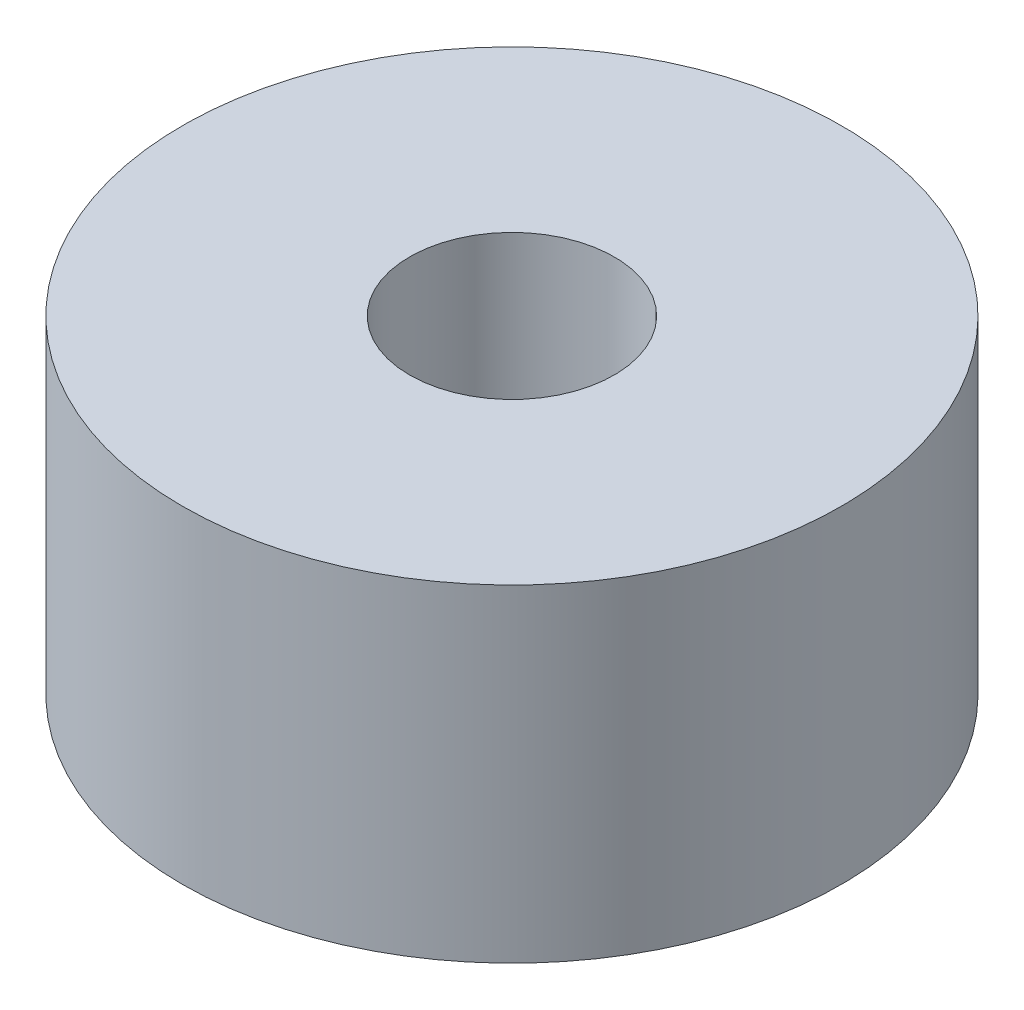
ISO-10303-21;
HEADER;
FILE_DESCRIPTION(('STEP AP214'),'2;1');
FILE_NAME('part.step','',(''),(''),'','','');
FILE_SCHEMA(('AUTOMOTIVE_DESIGN { 1 0 10303 214 1 1 1 1 }'));
ENDSEC;
DATA;
#1=APPLICATION_CONTEXT('core data for automotive mechanical design processes');
#2=APPLICATION_PROTOCOL_DEFINITION('international standard','automotive_design',2000,#1);
#3=PRODUCT_CONTEXT('',#1,'mechanical');
#4=PRODUCT('Part','Part','',(#3));
#5=PRODUCT_RELATED_PRODUCT_CATEGORY('part','',(#4));
#6=PRODUCT_DEFINITION_FORMATION('','',#4);
#7=PRODUCT_DEFINITION_CONTEXT('part definition',#1,'design');
#8=PRODUCT_DEFINITION('design','',#6,#7);
#9=PRODUCT_DEFINITION_SHAPE('','',#8);
#10=(LENGTH_UNIT() NAMED_UNIT(*) SI_UNIT(.MILLI.,.METRE.));
#11=(NAMED_UNIT(*) PLANE_ANGLE_UNIT() SI_UNIT($,.RADIAN.));
#12=(NAMED_UNIT(*) SI_UNIT($,.STERADIAN.) SOLID_ANGLE_UNIT());
#13=UNCERTAINTY_MEASURE_WITH_UNIT(LENGTH_MEASURE(1.E-05),#10,'distance_accuracy_value','');
#14=(GEOMETRIC_REPRESENTATION_CONTEXT(3) GLOBAL_UNCERTAINTY_ASSIGNED_CONTEXT((#13)) GLOBAL_UNIT_ASSIGNED_CONTEXT((#10,
#11,#12)) REPRESENTATION_CONTEXT('',''));
#15=CARTESIAN_POINT('',(0.,0.,0.));
#16=DIRECTION('',(0.,0.,1.));
#17=DIRECTION('',(1.,0.,0.));
#18=AXIS2_PLACEMENT_3D('',#15,#16,#17);
#19=CARTESIAN_POINT('',(0.,16.,0.));
#20=DIRECTION('',(0.,-1.,0.));
#21=DIRECTION('',(0.,0.,-1.));
#22=AXIS2_PLACEMENT_3D('',#19,#20,#21);
#23=CYLINDRICAL_SURFACE('',#22,16.1);
#24=CARTESIAN_POINT('',(0.,16.,0.));
#25=DIRECTION('',(0.,1.,0.));
#26=DIRECTION('',(0.,0.,1.));
#27=AXIS2_PLACEMENT_3D('',#24,#25,#26);
#28=CIRCLE('',#27,16.1);
#29=CARTESIAN_POINT('',(0.,16.,16.1));
#30=VERTEX_POINT('',#29);
#31=EDGE_CURVE('E10',#30,#30,#28,.T.);
#32=ORIENTED_EDGE('',*,*,#31,.F.);
#33=EDGE_LOOP('',(#32));
#34=FACE_BOUND('',#33,.T.);
#35=CARTESIAN_POINT('',(0.,0.,0.));
#36=DIRECTION('',(0.,1.,0.));
#37=DIRECTION('',(0.,0.,1.));
#38=AXIS2_PLACEMENT_3D('',#35,#36,#37);
#39=CIRCLE('',#38,16.1);
#40=CARTESIAN_POINT('',(0.,0.,16.1));
#41=VERTEX_POINT('',#40);
#42=EDGE_CURVE('E33',#41,#41,#39,.T.);
#43=ORIENTED_EDGE('',*,*,#42,.T.);
#44=EDGE_LOOP('',(#43));
#45=FACE_BOUND('',#44,.T.);
#46=ADVANCED_FACE('F30',(#34,#45),#23,.T.);
#47=CARTESIAN_POINT('',(0.,16.,0.));
#48=DIRECTION('',(0.,1.,0.));
#49=DIRECTION('',(0.,0.,1.));
#50=AXIS2_PLACEMENT_3D('',#47,#48,#49);
#51=PLANE('',#50);
#52=CARTESIAN_POINT('',(0.,16.,0.));
#53=DIRECTION('',(0.,1.,0.));
#54=DIRECTION('',(0.,0.,1.));
#55=AXIS2_PLACEMENT_3D('',#52,#53,#54);
#56=CIRCLE('',#55,5.);
#57=CARTESIAN_POINT('',(0.,16.,5.));
#58=VERTEX_POINT('',#57);
#59=EDGE_CURVE('E42',#58,#58,#56,.T.);
#60=ORIENTED_EDGE('',*,*,#59,.F.);
#61=EDGE_LOOP('',(#60));
#62=FACE_BOUND('',#61,.T.);
#63=ORIENTED_EDGE('',*,*,#31,.T.);
#64=EDGE_LOOP('',(#63));
#65=FACE_BOUND('',#64,.T.);
#66=ADVANCED_FACE('F57',(#62,#65),#51,.T.);
#67=CARTESIAN_POINT('',(0.,0.,0.));
#68=DIRECTION('',(0.,1.,0.));
#69=DIRECTION('',(0.,0.,1.));
#70=AXIS2_PLACEMENT_3D('',#67,#68,#69);
#71=PLANE('',#70);
#72=CARTESIAN_POINT('',(0.,0.,0.));
#73=DIRECTION('',(0.,1.,0.));
#74=DIRECTION('',(0.,0.,1.));
#75=AXIS2_PLACEMENT_3D('',#72,#73,#74);
#76=CIRCLE('',#75,5.);
#77=CARTESIAN_POINT('',(0.,0.,5.));
#78=VERTEX_POINT('',#77);
#79=EDGE_CURVE('E40',#78,#78,#76,.T.);
#80=ORIENTED_EDGE('',*,*,#79,.T.);
#81=EDGE_LOOP('',(#80));
#82=FACE_BOUND('',#81,.T.);
#83=ORIENTED_EDGE('',*,*,#42,.F.);
#84=EDGE_LOOP('',(#83));
#85=FACE_BOUND('',#84,.T.);
#86=ADVANCED_FACE('F48',(#82,#85),#71,.F.);
#87=CARTESIAN_POINT('',(0.,0.,0.));
#88=DIRECTION('',(0.,1.,0.));
#89=DIRECTION('',(0.,0.,1.));
#90=AXIS2_PLACEMENT_3D('',#87,#88,#89);
#91=CYLINDRICAL_SURFACE('',#90,5.);
#92=ORIENTED_EDGE('',*,*,#79,.F.);
#93=EDGE_LOOP('',(#92));
#94=FACE_BOUND('',#93,.T.);
#95=ORIENTED_EDGE('',*,*,#59,.T.);
#96=EDGE_LOOP('',(#95));
#97=FACE_BOUND('',#96,.T.);
#98=ADVANCED_FACE('F51',(#94,#97),#91,.F.);
#99=CLOSED_SHELL('',(#46,#66,#86,#98));
#100=MANIFOLD_SOLID_BREP('B2',#99);
#101=ADVANCED_BREP_SHAPE_REPRESENTATION('',(#18,#100),#14);
#102=SHAPE_DEFINITION_REPRESENTATION(#9,#101);
ENDSEC;
END-ISO-10303-21;
